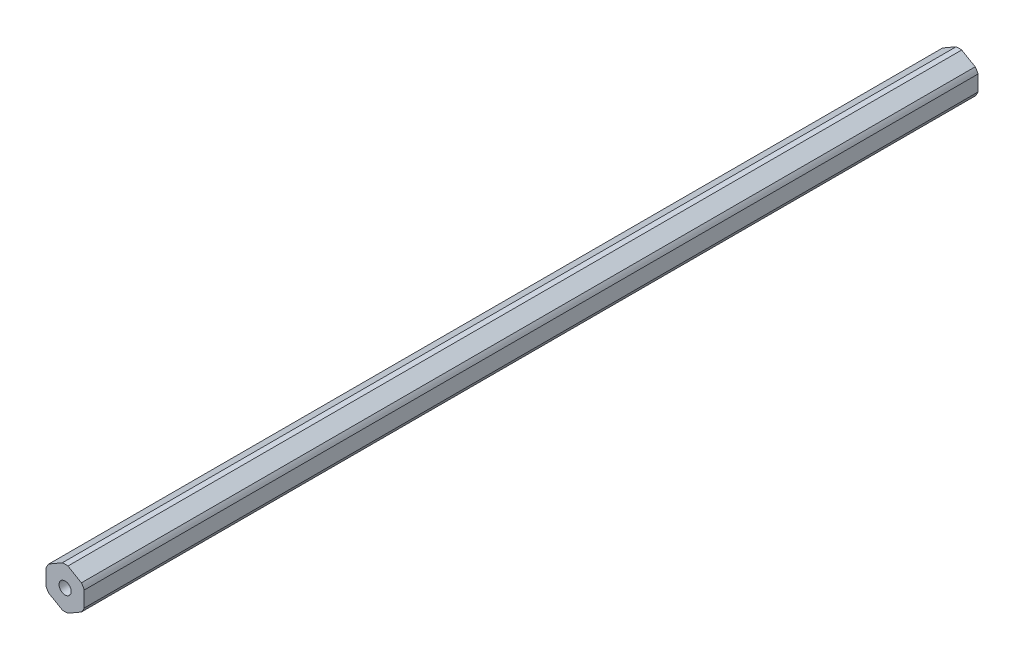
ISO-10303-21;
HEADER;
FILE_DESCRIPTION(('STEP AP214'),'2;1');
FILE_NAME('part.step','',(''),(''),'','','');
FILE_SCHEMA(('AUTOMOTIVE_DESIGN { 1 0 10303 214 1 1 1 1 }'));
ENDSEC;
DATA;
#1=APPLICATION_CONTEXT('core data for automotive mechanical design processes');
#2=APPLICATION_PROTOCOL_DEFINITION('international standard','automotive_design',2000,#1);
#3=PRODUCT_CONTEXT('',#1,'mechanical');
#4=PRODUCT('Part','Part','',(#3));
#5=PRODUCT_RELATED_PRODUCT_CATEGORY('part','',(#4));
#6=PRODUCT_DEFINITION_FORMATION('','',#4);
#7=PRODUCT_DEFINITION_CONTEXT('part definition',#1,'design');
#8=PRODUCT_DEFINITION('design','',#6,#7);
#9=PRODUCT_DEFINITION_SHAPE('','',#8);
#10=(LENGTH_UNIT() NAMED_UNIT(*) SI_UNIT(.MILLI.,.METRE.));
#11=(NAMED_UNIT(*) PLANE_ANGLE_UNIT() SI_UNIT($,.RADIAN.));
#12=(NAMED_UNIT(*) SI_UNIT($,.STERADIAN.) SOLID_ANGLE_UNIT());
#13=UNCERTAINTY_MEASURE_WITH_UNIT(LENGTH_MEASURE(1.E-05),#10,'distance_accuracy_value','');
#14=(GEOMETRIC_REPRESENTATION_CONTEXT(3) GLOBAL_UNCERTAINTY_ASSIGNED_CONTEXT((#13)) GLOBAL_UNIT_ASSIGNED_CONTEXT((#10,
#11,#12)) REPRESENTATION_CONTEXT('',''));
#15=CARTESIAN_POINT('',(0.,0.,0.));
#16=DIRECTION('',(0.,0.,1.));
#17=DIRECTION('',(1.,0.,0.));
#18=AXIS2_PLACEMENT_3D('',#15,#16,#17);
#19=CARTESIAN_POINT('',(6.35,0.,148.5265));
#20=DIRECTION('',(-1.,0.,0.));
#21=DIRECTION('',(0.,0.,1.));
#22=AXIS2_PLACEMENT_3D('',#19,#20,#21);
#23=PLANE('',#22);
#24=DIRECTION('',(0.,1.,0.));
#25=VECTOR('',#24,1.);
#26=CARTESIAN_POINT('',(6.35,0.,-148.5265));
#27=LINE('',#26,#25);
#28=CARTESIAN_POINT('',(6.35,-2.59030191290514,-148.5265));
#29=VERTEX_POINT('',#28);
#30=CARTESIAN_POINT('',(6.35,2.59030191290514,-148.5265));
#31=VERTEX_POINT('',#30);
#32=EDGE_CURVE('E173',#29,#31,#27,.T.);
#33=ORIENTED_EDGE('',*,*,#32,.T.);
#34=DIRECTION('',(0.,0.,-1.));
#35=VECTOR('',#34,1.);
#36=CARTESIAN_POINT('',(6.35,2.59030191290514,148.5265));
#37=LINE('',#36,#35);
#38=CARTESIAN_POINT('',(6.35,2.59030191290514,148.5265));
#39=VERTEX_POINT('',#38);
#40=EDGE_CURVE('E11',#39,#31,#37,.T.);
#41=ORIENTED_EDGE('',*,*,#40,.F.);
#42=DIRECTION('',(0.,1.,0.));
#43=VECTOR('',#42,1.);
#44=CARTESIAN_POINT('',(6.35,0.,148.5265));
#45=LINE('',#44,#43);
#46=CARTESIAN_POINT('',(6.35,-2.59030191290514,148.5265));
#47=VERTEX_POINT('',#46);
#48=EDGE_CURVE('E253',#47,#39,#45,.T.);
#49=ORIENTED_EDGE('',*,*,#48,.F.);
#50=DIRECTION('',(0.,0.,-1.));
#51=VECTOR('',#50,1.);
#52=CARTESIAN_POINT('',(6.35,-2.59030191290514,148.5265));
#53=LINE('',#52,#51);
#54=EDGE_CURVE('E169',#47,#29,#53,.T.);
#55=ORIENTED_EDGE('',*,*,#54,.T.);
#56=EDGE_LOOP('',(#33,#41,#49,#55));
#57=FACE_BOUND('',#56,.T.);
#58=ADVANCED_FACE('F47',(#57),#23,.F.);
#59=CARTESIAN_POINT('',(0.,0.,148.5265));
#60=DIRECTION('',(0.,0.,-1.));
#61=DIRECTION('',(-1.,0.,0.));
#62=AXIS2_PLACEMENT_3D('',#59,#60,#61);
#63=CYLINDRICAL_SURFACE('',#62,6.858);
#64=CARTESIAN_POINT('',(0.,0.,-148.5265));
#65=DIRECTION('',(0.,0.,1.));
#66=DIRECTION('',(1.,0.,0.));
#67=AXIS2_PLACEMENT_3D('',#64,#65,#66);
#68=CIRCLE('',#67,6.858);
#69=CARTESIAN_POINT('',(5.41826726004727,4.20411035757862,-148.5265));
#70=VERTEX_POINT('',#69);
#71=EDGE_CURVE('E177',#31,#70,#68,.T.);
#72=ORIENTED_EDGE('',*,*,#71,.T.);
#73=DIRECTION('',(0.,0.,-1.));
#74=VECTOR('',#73,1.);
#75=CARTESIAN_POINT('',(5.41826726004727,4.20411035757862,148.5265));
#76=LINE('',#75,#74);
#77=CARTESIAN_POINT('',(5.41826726004727,4.20411035757862,148.5265));
#78=VERTEX_POINT('',#77);
#79=EDGE_CURVE('E56',#78,#70,#76,.T.);
#80=ORIENTED_EDGE('',*,*,#79,.F.);
#81=CARTESIAN_POINT('',(0.,0.,148.5265));
#82=DIRECTION('',(0.,0.,1.));
#83=DIRECTION('',(1.,0.,0.));
#84=AXIS2_PLACEMENT_3D('',#81,#82,#83);
#85=CIRCLE('',#84,6.858);
#86=EDGE_CURVE('E119',#39,#78,#85,.T.);
#87=ORIENTED_EDGE('',*,*,#86,.F.);
#88=ORIENTED_EDGE('',*,*,#40,.T.);
#89=EDGE_LOOP('',(#72,#80,#87,#88));
#90=FACE_BOUND('',#89,.T.);
#91=ADVANCED_FACE('F297',(#90),#63,.T.);
#92=CARTESIAN_POINT('',(3.175,5.49926131403119,148.5265));
#93=DIRECTION('',(-0.5,-0.866025403784438,0.));
#94=DIRECTION('',(0.866025403784439,-0.5,0.));
#95=AXIS2_PLACEMENT_3D('',#92,#93,#94);
#96=PLANE('',#95);
#97=DIRECTION('',(-0.866025403784439,0.5,0.));
#98=VECTOR('',#97,1.);
#99=CARTESIAN_POINT('',(3.175,5.49926131403119,-148.5265));
#100=LINE('',#99,#98);
#101=CARTESIAN_POINT('',(0.93173273995273,6.79441227048375,-148.5265));
#102=VERTEX_POINT('',#101);
#103=EDGE_CURVE('E181',#70,#102,#100,.T.);
#104=ORIENTED_EDGE('',*,*,#103,.T.);
#105=DIRECTION('',(0.,0.,-1.));
#106=VECTOR('',#105,1.);
#107=CARTESIAN_POINT('',(0.93173273995273,6.79441227048375,148.5265));
#108=LINE('',#107,#106);
#109=CARTESIAN_POINT('',(0.93173273995273,6.79441227048375,148.5265));
#110=VERTEX_POINT('',#109);
#111=EDGE_CURVE('E224',#110,#102,#108,.T.);
#112=ORIENTED_EDGE('',*,*,#111,.F.);
#113=DIRECTION('',(-0.866025403784439,0.5,0.));
#114=VECTOR('',#113,1.);
#115=CARTESIAN_POINT('',(3.175,5.49926131403119,148.5265));
#116=LINE('',#115,#114);
#117=EDGE_CURVE('E234',#78,#110,#116,.T.);
#118=ORIENTED_EDGE('',*,*,#117,.F.);
#119=ORIENTED_EDGE('',*,*,#79,.T.);
#120=EDGE_LOOP('',(#104,#112,#118,#119));
#121=FACE_BOUND('',#120,.T.);
#122=ADVANCED_FACE('F232',(#121),#96,.F.);
#123=CARTESIAN_POINT('',(-0.931732739952724,6.79441227048375,-148.5265));
#124=VERTEX_POINT('',#123);
#125=EDGE_CURVE('E182',#102,#124,#68,.T.);
#126=ORIENTED_EDGE('',*,*,#125,.T.);
#127=DIRECTION('',(0.,0.,-1.));
#128=VECTOR('',#127,1.);
#129=CARTESIAN_POINT('',(-0.931732739952724,6.79441227048375,148.5265));
#130=LINE('',#129,#128);
#131=CARTESIAN_POINT('',(-0.931732739952724,6.79441227048375,148.5265));
#132=VERTEX_POINT('',#131);
#133=EDGE_CURVE('E220',#132,#124,#130,.T.);
#134=ORIENTED_EDGE('',*,*,#133,.F.);
#135=EDGE_CURVE('E259',#110,#132,#85,.T.);
#136=ORIENTED_EDGE('',*,*,#135,.F.);
#137=ORIENTED_EDGE('',*,*,#111,.T.);
#138=EDGE_LOOP('',(#126,#134,#136,#137));
#139=FACE_BOUND('',#138,.T.);
#140=ADVANCED_FACE('F280',(#139),#63,.T.);
#141=CARTESIAN_POINT('',(-3.175,5.49926131403119,148.5265));
#142=DIRECTION('',(0.5,-0.866025403784439,0.));
#143=DIRECTION('',(0.866025403784439,0.5,0.));
#144=AXIS2_PLACEMENT_3D('',#141,#142,#143);
#145=PLANE('',#144);
#146=DIRECTION('',(-0.866025403784439,-0.5,0.));
#147=VECTOR('',#146,1.);
#148=CARTESIAN_POINT('',(-3.175,5.49926131403119,-148.5265));
#149=LINE('',#148,#147);
#150=CARTESIAN_POINT('',(-5.41826726004727,4.20411035757862,-148.5265));
#151=VERTEX_POINT('',#150);
#152=EDGE_CURVE('E185',#124,#151,#149,.T.);
#153=ORIENTED_EDGE('',*,*,#152,.T.);
#154=DIRECTION('',(0.,0.,-1.));
#155=VECTOR('',#154,1.);
#156=CARTESIAN_POINT('',(-5.41826726004727,4.20411035757862,148.5265));
#157=LINE('',#156,#155);
#158=CARTESIAN_POINT('',(-5.41826726004727,4.20411035757862,148.5265));
#159=VERTEX_POINT('',#158);
#160=EDGE_CURVE('E216',#159,#151,#157,.T.);
#161=ORIENTED_EDGE('',*,*,#160,.F.);
#162=DIRECTION('',(-0.866025403784439,-0.5,0.));
#163=VECTOR('',#162,1.);
#164=CARTESIAN_POINT('',(-3.175,5.49926131403119,148.5265));
#165=LINE('',#164,#163);
#166=EDGE_CURVE('E266',#132,#159,#165,.T.);
#167=ORIENTED_EDGE('',*,*,#166,.F.);
#168=ORIENTED_EDGE('',*,*,#133,.T.);
#169=EDGE_LOOP('',(#153,#161,#167,#168));
#170=FACE_BOUND('',#169,.T.);
#171=ADVANCED_FACE('F282',(#170),#145,.F.);
#172=CARTESIAN_POINT('',(-6.35,2.59030191290514,-148.5265));
#173=VERTEX_POINT('',#172);
#174=EDGE_CURVE('E188',#151,#173,#68,.T.);
#175=ORIENTED_EDGE('',*,*,#174,.T.);
#176=DIRECTION('',(0.,0.,-1.));
#177=VECTOR('',#176,1.);
#178=CARTESIAN_POINT('',(-6.35,2.59030191290514,148.5265));
#179=LINE('',#178,#177);
#180=CARTESIAN_POINT('',(-6.35,2.59030191290514,148.5265));
#181=VERTEX_POINT('',#180);
#182=EDGE_CURVE('E212',#181,#173,#179,.T.);
#183=ORIENTED_EDGE('',*,*,#182,.F.);
#184=EDGE_CURVE('E268',#159,#181,#85,.T.);
#185=ORIENTED_EDGE('',*,*,#184,.F.);
#186=ORIENTED_EDGE('',*,*,#160,.T.);
#187=EDGE_LOOP('',(#175,#183,#185,#186));
#188=FACE_BOUND('',#187,.T.);
#189=ADVANCED_FACE('F283',(#188),#63,.T.);
#190=CARTESIAN_POINT('',(-6.35,0.,148.5265));
#191=DIRECTION('',(1.,0.,0.));
#192=DIRECTION('',(0.,1.,0.));
#193=AXIS2_PLACEMENT_3D('',#190,#191,#192);
#194=PLANE('',#193);
#195=DIRECTION('',(0.,-1.,0.));
#196=VECTOR('',#195,1.);
#197=CARTESIAN_POINT('',(-6.35,0.,-148.5265));
#198=LINE('',#197,#196);
#199=CARTESIAN_POINT('',(-6.35,-2.59030191290514,-148.5265));
#200=VERTEX_POINT('',#199);
#201=EDGE_CURVE('E189',#173,#200,#198,.T.);
#202=ORIENTED_EDGE('',*,*,#201,.T.);
#203=DIRECTION('',(0.,0.,-1.));
#204=VECTOR('',#203,1.);
#205=CARTESIAN_POINT('',(-6.35,-2.59030191290514,148.5265));
#206=LINE('',#205,#204);
#207=CARTESIAN_POINT('',(-6.35,-2.59030191290514,148.5265));
#208=VERTEX_POINT('',#207);
#209=EDGE_CURVE('E208',#208,#200,#206,.T.);
#210=ORIENTED_EDGE('',*,*,#209,.F.);
#211=DIRECTION('',(0.,-1.,0.));
#212=VECTOR('',#211,1.);
#213=CARTESIAN_POINT('',(-6.35,0.,148.5265));
#214=LINE('',#213,#212);
#215=EDGE_CURVE('E269',#181,#208,#214,.T.);
#216=ORIENTED_EDGE('',*,*,#215,.F.);
#217=ORIENTED_EDGE('',*,*,#182,.T.);
#218=EDGE_LOOP('',(#202,#210,#216,#217));
#219=FACE_BOUND('',#218,.T.);
#220=ADVANCED_FACE('F286',(#219),#194,.F.);
#221=CARTESIAN_POINT('',(-5.41826726004728,-4.20411035757861,-148.5265));
#222=VERTEX_POINT('',#221);
#223=EDGE_CURVE('E192',#200,#222,#68,.T.);
#224=ORIENTED_EDGE('',*,*,#223,.T.);
#225=DIRECTION('',(0.,0.,-1.));
#226=VECTOR('',#225,1.);
#227=CARTESIAN_POINT('',(-5.41826726004728,-4.20411035757861,148.5265));
#228=LINE('',#227,#226);
#229=CARTESIAN_POINT('',(-5.41826726004728,-4.20411035757861,148.5265));
#230=VERTEX_POINT('',#229);
#231=EDGE_CURVE('E204',#230,#222,#228,.T.);
#232=ORIENTED_EDGE('',*,*,#231,.F.);
#233=EDGE_CURVE('E156',#208,#230,#85,.T.);
#234=ORIENTED_EDGE('',*,*,#233,.F.);
#235=ORIENTED_EDGE('',*,*,#209,.T.);
#236=EDGE_LOOP('',(#224,#232,#234,#235));
#237=FACE_BOUND('',#236,.T.);
#238=ADVANCED_FACE('F288',(#237),#63,.T.);
#239=CARTESIAN_POINT('',(-3.175,-5.49926131403118,148.5265));
#240=DIRECTION('',(0.5,0.866025403784439,0.));
#241=DIRECTION('',(-0.866025403784439,0.5,0.));
#242=AXIS2_PLACEMENT_3D('',#239,#240,#241);
#243=PLANE('',#242);
#244=DIRECTION('',(0.866025403784439,-0.5,0.));
#245=VECTOR('',#244,1.);
#246=CARTESIAN_POINT('',(-3.175,-5.49926131403118,-148.5265));
#247=LINE('',#246,#245);
#248=CARTESIAN_POINT('',(-0.931732739952717,-6.79441227048375,-148.5265));
#249=VERTEX_POINT('',#248);
#250=EDGE_CURVE('E193',#222,#249,#247,.T.);
#251=ORIENTED_EDGE('',*,*,#250,.T.);
#252=DIRECTION('',(0.,0.,-1.));
#253=VECTOR('',#252,1.);
#254=CARTESIAN_POINT('',(-0.931732739952717,-6.79441227048375,148.5265));
#255=LINE('',#254,#253);
#256=CARTESIAN_POINT('',(-0.931732739952717,-6.79441227048375,148.5265));
#257=VERTEX_POINT('',#256);
#258=EDGE_CURVE('E162',#257,#249,#255,.T.);
#259=ORIENTED_EDGE('',*,*,#258,.F.);
#260=DIRECTION('',(0.866025403784439,-0.5,0.));
#261=VECTOR('',#260,1.);
#262=CARTESIAN_POINT('',(-3.175,-5.49926131403118,148.5265));
#263=LINE('',#262,#261);
#264=EDGE_CURVE('E150',#230,#257,#263,.T.);
#265=ORIENTED_EDGE('',*,*,#264,.F.);
#266=ORIENTED_EDGE('',*,*,#231,.T.);
#267=EDGE_LOOP('',(#251,#259,#265,#266));
#268=FACE_BOUND('',#267,.T.);
#269=ADVANCED_FACE('F291',(#268),#243,.F.);
#270=CARTESIAN_POINT('',(0.931732739952728,-6.79441227048375,-148.5265));
#271=VERTEX_POINT('',#270);
#272=EDGE_CURVE('E160',#249,#271,#68,.T.);
#273=ORIENTED_EDGE('',*,*,#272,.T.);
#274=DIRECTION('',(0.,0.,-1.));
#275=VECTOR('',#274,1.);
#276=CARTESIAN_POINT('',(0.931732739952728,-6.79441227048375,148.5265));
#277=LINE('',#276,#275);
#278=CARTESIAN_POINT('',(0.931732739952728,-6.79441227048375,148.5265));
#279=VERTEX_POINT('',#278);
#280=EDGE_CURVE('E157',#279,#271,#277,.T.);
#281=ORIENTED_EDGE('',*,*,#280,.F.);
#282=EDGE_CURVE('E144',#257,#279,#85,.T.);
#283=ORIENTED_EDGE('',*,*,#282,.F.);
#284=ORIENTED_EDGE('',*,*,#258,.T.);
#285=EDGE_LOOP('',(#273,#281,#283,#284));
#286=FACE_BOUND('',#285,.T.);
#287=ADVANCED_FACE('F158',(#286),#63,.T.);
#288=CARTESIAN_POINT('',(3.175,-5.49926131403119,148.5265));
#289=DIRECTION('',(-0.5,0.866025403784439,0.));
#290=DIRECTION('',(-0.866025403784439,-0.5,0.));
#291=AXIS2_PLACEMENT_3D('',#288,#289,#290);
#292=PLANE('',#291);
#293=DIRECTION('',(0.866025403784439,0.5,0.));
#294=VECTOR('',#293,1.);
#295=CARTESIAN_POINT('',(3.175,-5.49926131403119,-148.5265));
#296=LINE('',#295,#294);
#297=CARTESIAN_POINT('',(5.41826726004727,-4.20411035757862,-148.5265));
#298=VERTEX_POINT('',#297);
#299=EDGE_CURVE('E105',#271,#298,#296,.T.);
#300=ORIENTED_EDGE('',*,*,#299,.T.);
#301=DIRECTION('',(0.,0.,-1.));
#302=VECTOR('',#301,1.);
#303=CARTESIAN_POINT('',(5.41826726004727,-4.20411035757862,148.5265));
#304=LINE('',#303,#302);
#305=CARTESIAN_POINT('',(5.41826726004727,-4.20411035757862,148.5265));
#306=VERTEX_POINT('',#305);
#307=EDGE_CURVE('E163',#306,#298,#304,.T.);
#308=ORIENTED_EDGE('',*,*,#307,.F.);
#309=DIRECTION('',(0.866025403784439,0.5,0.));
#310=VECTOR('',#309,1.);
#311=CARTESIAN_POINT('',(3.175,-5.49926131403119,148.5265));
#312=LINE('',#311,#310);
#313=EDGE_CURVE('E148',#279,#306,#312,.T.);
#314=ORIENTED_EDGE('',*,*,#313,.F.);
#315=ORIENTED_EDGE('',*,*,#280,.T.);
#316=EDGE_LOOP('',(#300,#308,#314,#315));
#317=FACE_BOUND('',#316,.T.);
#318=ADVANCED_FACE('F165',(#317),#292,.F.);
#319=EDGE_CURVE('E111',#298,#29,#68,.T.);
#320=ORIENTED_EDGE('',*,*,#319,.T.);
#321=ORIENTED_EDGE('',*,*,#54,.F.);
#322=EDGE_CURVE('E64',#306,#47,#85,.T.);
#323=ORIENTED_EDGE('',*,*,#322,.F.);
#324=ORIENTED_EDGE('',*,*,#307,.T.);
#325=EDGE_LOOP('',(#320,#321,#323,#324));
#326=FACE_BOUND('',#325,.T.);
#327=ADVANCED_FACE('F294',(#326),#63,.T.);
#328=CARTESIAN_POINT('',(0.,0.,148.5265));
#329=DIRECTION('',(0.,0.,1.));
#330=DIRECTION('',(1.,0.,0.));
#331=AXIS2_PLACEMENT_3D('',#328,#329,#330);
#332=PLANE('',#331);
#333=CARTESIAN_POINT('',(0.,0.,148.5265));
#334=DIRECTION('',(0.,0.,1.));
#335=DIRECTION('',(1.,0.,0.));
#336=AXIS2_PLACEMENT_3D('',#333,#334,#335);
#337=CIRCLE('',#336,2.0193);
#338=CARTESIAN_POINT('',(2.0193,0.,148.5265));
#339=VERTEX_POINT('',#338);
#340=EDGE_CURVE('E261',#339,#339,#337,.T.);
#341=ORIENTED_EDGE('',*,*,#340,.F.);
#342=EDGE_LOOP('',(#341));
#343=FACE_BOUND('',#342,.T.);
#344=ORIENTED_EDGE('',*,*,#48,.T.);
#345=ORIENTED_EDGE('',*,*,#86,.T.);
#346=ORIENTED_EDGE('',*,*,#117,.T.);
#347=ORIENTED_EDGE('',*,*,#135,.T.);
#348=ORIENTED_EDGE('',*,*,#166,.T.);
#349=ORIENTED_EDGE('',*,*,#184,.T.);
#350=ORIENTED_EDGE('',*,*,#215,.T.);
#351=ORIENTED_EDGE('',*,*,#233,.T.);
#352=ORIENTED_EDGE('',*,*,#264,.T.);
#353=ORIENTED_EDGE('',*,*,#282,.T.);
#354=ORIENTED_EDGE('',*,*,#313,.T.);
#355=ORIENTED_EDGE('',*,*,#322,.T.);
#356=EDGE_LOOP('',(#344,#345,#346,#347,#348,#349,#350,#351,#352,#353,#354,#355));
#357=FACE_BOUND('',#356,.T.);
#358=ADVANCED_FACE('F146',(#343,#357),#332,.T.);
#359=CARTESIAN_POINT('',(0.,0.,-148.5265));
#360=DIRECTION('',(0.,0.,1.));
#361=DIRECTION('',(1.,0.,0.));
#362=AXIS2_PLACEMENT_3D('',#359,#360,#361);
#363=PLANE('',#362);
#364=CARTESIAN_POINT('',(0.,0.,-148.5265));
#365=DIRECTION('',(0.,0.,1.));
#366=DIRECTION('',(1.,0.,0.));
#367=AXIS2_PLACEMENT_3D('',#364,#365,#366);
#368=CIRCLE('',#367,2.0193);
#369=CARTESIAN_POINT('',(2.0193,0.,-148.5265));
#370=VERTEX_POINT('',#369);
#371=EDGE_CURVE('E178',#370,#370,#368,.T.);
#372=ORIENTED_EDGE('',*,*,#371,.T.);
#373=EDGE_LOOP('',(#372));
#374=FACE_BOUND('',#373,.T.);
#375=ORIENTED_EDGE('',*,*,#32,.F.);
#376=ORIENTED_EDGE('',*,*,#319,.F.);
#377=ORIENTED_EDGE('',*,*,#299,.F.);
#378=ORIENTED_EDGE('',*,*,#272,.F.);
#379=ORIENTED_EDGE('',*,*,#250,.F.);
#380=ORIENTED_EDGE('',*,*,#223,.F.);
#381=ORIENTED_EDGE('',*,*,#201,.F.);
#382=ORIENTED_EDGE('',*,*,#174,.F.);
#383=ORIENTED_EDGE('',*,*,#152,.F.);
#384=ORIENTED_EDGE('',*,*,#125,.F.);
#385=ORIENTED_EDGE('',*,*,#103,.F.);
#386=ORIENTED_EDGE('',*,*,#71,.F.);
#387=EDGE_LOOP('',(#375,#376,#377,#378,#379,#380,#381,#382,#383,#384,#385,#386));
#388=FACE_BOUND('',#387,.T.);
#389=ADVANCED_FACE('F238',(#374,#388),#363,.F.);
#390=CARTESIAN_POINT('',(0.,0.,-148.5265));
#391=DIRECTION('',(0.,0.,1.));
#392=DIRECTION('',(1.,0.,0.));
#393=AXIS2_PLACEMENT_3D('',#390,#391,#392);
#394=CYLINDRICAL_SURFACE('',#393,2.0193);
#395=CARTESIAN_POINT('',(2.0193,0.,-148.5265));
#396=CARTESIAN_POINT('',(2.0193,0.,-145.432197916667));
#397=CARTESIAN_POINT('',(2.0193,0.,-142.337895833333));
#398=CARTESIAN_POINT('',(2.0193,0.,-136.149291666667));
#399=CARTESIAN_POINT('',(2.0193,0.,-133.054989583333));
#400=CARTESIAN_POINT('',(2.0193,0.,-126.866385416667));
#401=CARTESIAN_POINT('',(2.0193,0.,-123.772083333333));
#402=CARTESIAN_POINT('',(2.0193,0.,-117.583479166667));
#403=CARTESIAN_POINT('',(2.0193,0.,-114.489177083333));
#404=CARTESIAN_POINT('',(2.0193,0.,-108.300572916667));
#405=CARTESIAN_POINT('',(2.0193,0.,-105.206270833333));
#406=CARTESIAN_POINT('',(2.0193,0.,-99.0176666666667));
#407=CARTESIAN_POINT('',(2.0193,0.,-95.9233645833334));
#408=CARTESIAN_POINT('',(2.0193,0.,-89.7347604166667));
#409=CARTESIAN_POINT('',(2.0193,0.,-86.6404583333334));
#410=CARTESIAN_POINT('',(2.0193,0.,-80.4518541666667));
#411=CARTESIAN_POINT('',(2.0193,0.,-77.3575520833334));
#412=CARTESIAN_POINT('',(2.0193,0.,-71.1689479166667));
#413=CARTESIAN_POINT('',(2.0193,0.,-68.0746458333334));
#414=CARTESIAN_POINT('',(2.0193,0.,-61.8860416666667));
#415=CARTESIAN_POINT('',(2.0193,0.,-58.7917395833334));
#416=CARTESIAN_POINT('',(2.0193,0.,-52.6031354166667));
#417=CARTESIAN_POINT('',(2.0193,0.,-49.5088333333334));
#418=CARTESIAN_POINT('',(2.0193,0.,-43.3202291666667));
#419=CARTESIAN_POINT('',(2.0193,0.,-40.2259270833334));
#420=CARTESIAN_POINT('',(2.0193,0.,-34.0373229166667));
#421=CARTESIAN_POINT('',(2.0193,0.,-30.9430208333334));
#422=CARTESIAN_POINT('',(2.0193,0.,-24.7544166666667));
#423=CARTESIAN_POINT('',(2.0193,0.,-21.6601145833334));
#424=CARTESIAN_POINT('',(2.0193,0.,-15.4715104166667));
#425=CARTESIAN_POINT('',(2.0193,0.,-12.3772083333334));
#426=CARTESIAN_POINT('',(2.0193,0.,-6.1886041666667));
#427=CARTESIAN_POINT('',(2.0193,0.,-3.09430208333336));
#428=CARTESIAN_POINT('',(2.0193,0.,3.09430208333331));
#429=CARTESIAN_POINT('',(2.0193,0.,6.18860416666664));
#430=CARTESIAN_POINT('',(2.0193,0.,12.3772083333333));
#431=CARTESIAN_POINT('',(2.0193,0.,15.4715104166666));
#432=CARTESIAN_POINT('',(2.0193,0.,21.6601145833333));
#433=CARTESIAN_POINT('',(2.0193,0.,24.7544166666666));
#434=CARTESIAN_POINT('',(2.0193,0.,30.9430208333333));
#435=CARTESIAN_POINT('',(2.0193,0.,34.0373229166666));
#436=CARTESIAN_POINT('',(2.0193,0.,40.2259270833333));
#437=CARTESIAN_POINT('',(2.0193,0.,43.3202291666666));
#438=CARTESIAN_POINT('',(2.0193,0.,49.5088333333333));
#439=CARTESIAN_POINT('',(2.0193,0.,52.6031354166666));
#440=CARTESIAN_POINT('',(2.0193,0.,58.7917395833333));
#441=CARTESIAN_POINT('',(2.0193,0.,61.8860416666666));
#442=CARTESIAN_POINT('',(2.0193,0.,68.0746458333333));
#443=CARTESIAN_POINT('',(2.0193,0.,71.1689479166666));
#444=CARTESIAN_POINT('',(2.0193,0.,77.3575520833333));
#445=CARTESIAN_POINT('',(2.0193,0.,80.4518541666666));
#446=CARTESIAN_POINT('',(2.0193,0.,86.6404583333333));
#447=CARTESIAN_POINT('',(2.0193,0.,89.7347604166666));
#448=CARTESIAN_POINT('',(2.0193,0.,95.9233645833333));
#449=CARTESIAN_POINT('',(2.0193,0.,99.0176666666666));
#450=CARTESIAN_POINT('',(2.0193,0.,105.206270833333));
#451=CARTESIAN_POINT('',(2.0193,0.,108.300572916667));
#452=CARTESIAN_POINT('',(2.0193,0.,114.489177083333));
#453=CARTESIAN_POINT('',(2.0193,0.,117.583479166667));
#454=CARTESIAN_POINT('',(2.0193,0.,123.772083333333));
#455=CARTESIAN_POINT('',(2.0193,0.,126.866385416667));
#456=CARTESIAN_POINT('',(2.0193,0.,133.054989583333));
#457=CARTESIAN_POINT('',(2.0193,0.,136.149291666667));
#458=CARTESIAN_POINT('',(2.0193,0.,142.337895833333));
#459=CARTESIAN_POINT('',(2.0193,0.,145.432197916667));
#460=CARTESIAN_POINT('',(2.0193,0.,148.5265));
#461=B_SPLINE_CURVE_WITH_KNOTS('',3,(#395,#396,#397,#398,#399,#400,#401,#402,#403,#404,#405,
#406,#407,#408,#409,#410,#411,#412,#413,#414,#415,#416,#417,#418,#419,#420,#421,#422,#423,#424,
#425,#426,#427,#428,#429,#430,#431,#432,#433,#434,#435,#436,#437,#438,#439,#440,#441,#442,#443,
#444,#445,#446,#447,#448,#449,#450,#451,#452,#453,#454,#455,#456,#457,#458,#459,#460),
.UNSPECIFIED.,.F.,.F.,(4,2,2,2,2,2,2,2,2,2,2,2,2,2,2,2,2,2,2,2,2,2,2,2,2,2,2,2,2,2,2,2,4),(0.,
9.28290624999997,18.5658125,27.84871875,37.131625,46.41453125,55.6974375,64.98034375,74.26325,
83.54615625,92.8290625,102.11196875,111.394875,120.67778125,129.9606875,139.24359375,148.5265,
157.80940625,167.0923125,176.37521875,185.658125,194.94103125,204.2239375,213.50684375,
222.78975,232.07265625,241.3555625,250.63846875,259.921375,269.20428125,278.4871875,
287.77009375,297.053),.UNSPECIFIED.);
#462=EDGE_CURVE('BSEAM391',#370,#339,#461,.T.);
#463=ORIENTED_EDGE('',*,*,#371,.F.);
#464=ORIENTED_EDGE('',*,*,#340,.T.);
#465=ORIENTED_EDGE('',*,*,#462,.T.);
#466=ORIENTED_EDGE('',*,*,#462,.F.);
#467=EDGE_LOOP('',(#463,#465,#464,#466));
#468=FACE_BOUND('',#467,.T.);
#469=ADVANCED_FACE('F391',(#468),#394,.F.);
#470=CLOSED_SHELL('',(#58,#91,#122,#140,#171,#189,#220,#238,#269,#287,#318,#327,#358,#389,#469));
#471=MANIFOLD_SOLID_BREP('B2',#470);
#472=ADVANCED_BREP_SHAPE_REPRESENTATION('',(#18,#471),#14);
#473=SHAPE_DEFINITION_REPRESENTATION(#9,#472);
ENDSEC;
END-ISO-10303-21;
